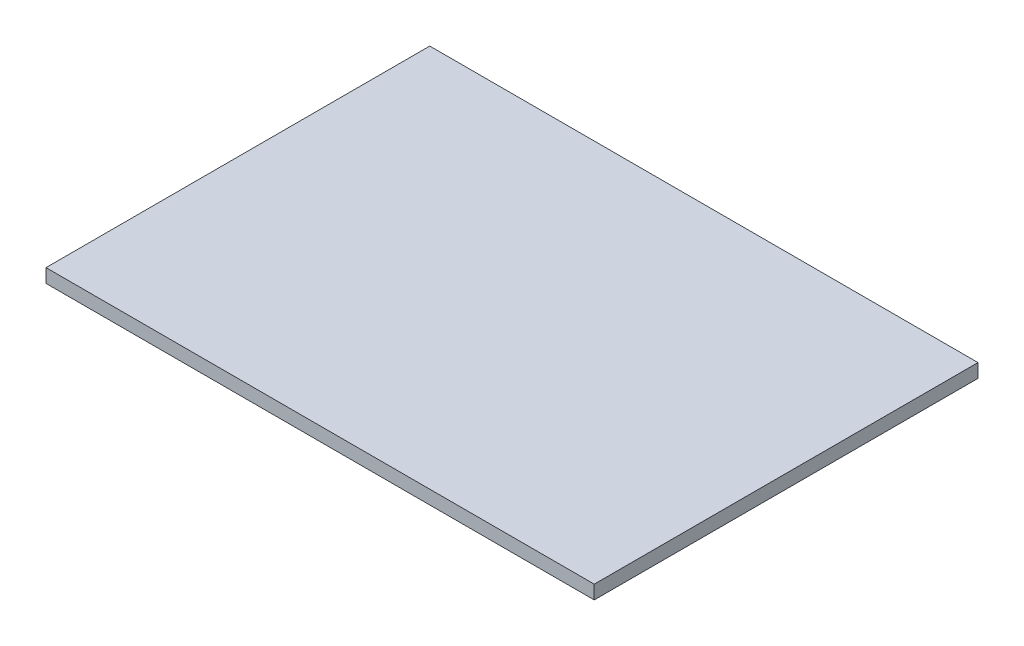
ISO-10303-21;
HEADER;
FILE_DESCRIPTION(('STEP AP214'),'2;1');
FILE_NAME('part.step','',(''),(''),'','','');
FILE_SCHEMA(('AUTOMOTIVE_DESIGN { 1 0 10303 214 1 1 1 1 }'));
ENDSEC;
DATA;
#1=APPLICATION_CONTEXT('core data for automotive mechanical design processes');
#2=APPLICATION_PROTOCOL_DEFINITION('international standard','automotive_design',2000,#1);
#3=PRODUCT_CONTEXT('',#1,'mechanical');
#4=PRODUCT('Part','Part','',(#3));
#5=PRODUCT_RELATED_PRODUCT_CATEGORY('part','',(#4));
#6=PRODUCT_DEFINITION_FORMATION('','',#4);
#7=PRODUCT_DEFINITION_CONTEXT('part definition',#1,'design');
#8=PRODUCT_DEFINITION('design','',#6,#7);
#9=PRODUCT_DEFINITION_SHAPE('','',#8);
#10=(LENGTH_UNIT() NAMED_UNIT(*) SI_UNIT(.MILLI.,.METRE.));
#11=(NAMED_UNIT(*) PLANE_ANGLE_UNIT() SI_UNIT($,.RADIAN.));
#12=(NAMED_UNIT(*) SI_UNIT($,.STERADIAN.) SOLID_ANGLE_UNIT());
#13=UNCERTAINTY_MEASURE_WITH_UNIT(LENGTH_MEASURE(1.E-05),#10,'distance_accuracy_value','');
#14=(GEOMETRIC_REPRESENTATION_CONTEXT(3) GLOBAL_UNCERTAINTY_ASSIGNED_CONTEXT((#13)) GLOBAL_UNIT_ASSIGNED_CONTEXT((#10,
#11,#12)) REPRESENTATION_CONTEXT('',''));
#15=CARTESIAN_POINT('',(0.,0.,0.));
#16=DIRECTION('',(0.,0.,1.));
#17=DIRECTION('',(1.,0.,0.));
#18=AXIS2_PLACEMENT_3D('',#15,#16,#17);
#19=CARTESIAN_POINT('',(0.,12.7,0.));
#20=DIRECTION('',(1.,0.,0.));
#21=DIRECTION('',(0.,0.,-1.));
#22=AXIS2_PLACEMENT_3D('',#19,#20,#21);
#23=PLANE('',#22);
#24=DIRECTION('',(0.,0.,1.));
#25=VECTOR('',#24,1.);
#26=CARTESIAN_POINT('',(0.,0.,0.));
#27=LINE('',#26,#25);
#28=CARTESIAN_POINT('',(0.,0.,-355.6));
#29=VERTEX_POINT('',#28);
#30=CARTESIAN_POINT('',(0.,0.,0.));
#31=VERTEX_POINT('',#30);
#32=EDGE_CURVE('E100',#29,#31,#27,.T.);
#33=ORIENTED_EDGE('',*,*,#32,.T.);
#34=DIRECTION('',(0.,-1.,0.));
#35=VECTOR('',#34,1.);
#36=CARTESIAN_POINT('',(0.,12.7,0.));
#37=LINE('',#36,#35);
#38=CARTESIAN_POINT('',(0.,12.7,0.));
#39=VERTEX_POINT('',#38);
#40=EDGE_CURVE('E11',#39,#31,#37,.T.);
#41=ORIENTED_EDGE('',*,*,#40,.F.);
#42=DIRECTION('',(0.,0.,1.));
#43=VECTOR('',#42,1.);
#44=CARTESIAN_POINT('',(0.,12.7,0.));
#45=LINE('',#44,#43);
#46=CARTESIAN_POINT('',(0.,12.7,-355.6));
#47=VERTEX_POINT('',#46);
#48=EDGE_CURVE('E88',#47,#39,#45,.T.);
#49=ORIENTED_EDGE('',*,*,#48,.F.);
#50=DIRECTION('',(0.,-1.,0.));
#51=VECTOR('',#50,1.);
#52=CARTESIAN_POINT('',(0.,12.7,-355.6));
#53=LINE('',#52,#51);
#54=EDGE_CURVE('E96',#47,#29,#53,.T.);
#55=ORIENTED_EDGE('',*,*,#54,.T.);
#56=EDGE_LOOP('',(#33,#41,#49,#55));
#57=FACE_BOUND('',#56,.T.);
#58=ADVANCED_FACE('F37',(#57),#23,.F.);
#59=CARTESIAN_POINT('',(0.,12.7,0.));
#60=DIRECTION('',(0.,0.,-1.));
#61=DIRECTION('',(-1.,0.,0.));
#62=AXIS2_PLACEMENT_3D('',#59,#60,#61);
#63=PLANE('',#62);
#64=DIRECTION('',(1.,0.,0.));
#65=VECTOR('',#64,1.);
#66=CARTESIAN_POINT('',(0.,0.,0.));
#67=LINE('',#66,#65);
#68=CARTESIAN_POINT('',(508.,0.,0.));
#69=VERTEX_POINT('',#68);
#70=EDGE_CURVE('E92',#31,#69,#67,.T.);
#71=ORIENTED_EDGE('',*,*,#70,.T.);
#72=DIRECTION('',(0.,-1.,0.));
#73=VECTOR('',#72,1.);
#74=CARTESIAN_POINT('',(508.,12.7,0.));
#75=LINE('',#74,#73);
#76=CARTESIAN_POINT('',(508.,12.7,0.));
#77=VERTEX_POINT('',#76);
#78=EDGE_CURVE('E45',#77,#69,#75,.T.);
#79=ORIENTED_EDGE('',*,*,#78,.F.);
#80=DIRECTION('',(1.,0.,0.));
#81=VECTOR('',#80,1.);
#82=CARTESIAN_POINT('',(0.,12.7,0.));
#83=LINE('',#82,#81);
#84=EDGE_CURVE('E83',#39,#77,#83,.T.);
#85=ORIENTED_EDGE('',*,*,#84,.F.);
#86=ORIENTED_EDGE('',*,*,#40,.T.);
#87=EDGE_LOOP('',(#71,#79,#85,#86));
#88=FACE_BOUND('',#87,.T.);
#89=ADVANCED_FACE('F91',(#88),#63,.F.);
#90=CARTESIAN_POINT('',(508.,12.7,0.));
#91=DIRECTION('',(-1.,0.,0.));
#92=DIRECTION('',(0.,0.,1.));
#93=AXIS2_PLACEMENT_3D('',#90,#91,#92);
#94=PLANE('',#93);
#95=DIRECTION('',(0.,0.,-1.));
#96=VECTOR('',#95,1.);
#97=CARTESIAN_POINT('',(508.,0.,0.));
#98=LINE('',#97,#96);
#99=CARTESIAN_POINT('',(508.,0.,-355.6));
#100=VERTEX_POINT('',#99);
#101=EDGE_CURVE('E70',#69,#100,#98,.T.);
#102=ORIENTED_EDGE('',*,*,#101,.T.);
#103=DIRECTION('',(0.,-1.,0.));
#104=VECTOR('',#103,1.);
#105=CARTESIAN_POINT('',(508.,12.7,-355.6));
#106=LINE('',#105,#104);
#107=CARTESIAN_POINT('',(508.,12.7,-355.6));
#108=VERTEX_POINT('',#107);
#109=EDGE_CURVE('E93',#108,#100,#106,.T.);
#110=ORIENTED_EDGE('',*,*,#109,.F.);
#111=DIRECTION('',(0.,0.,-1.));
#112=VECTOR('',#111,1.);
#113=CARTESIAN_POINT('',(508.,12.7,0.));
#114=LINE('',#113,#112);
#115=EDGE_CURVE('E86',#77,#108,#114,.T.);
#116=ORIENTED_EDGE('',*,*,#115,.F.);
#117=ORIENTED_EDGE('',*,*,#78,.T.);
#118=EDGE_LOOP('',(#102,#110,#116,#117));
#119=FACE_BOUND('',#118,.T.);
#120=ADVANCED_FACE('F94',(#119),#94,.F.);
#121=CARTESIAN_POINT('',(0.,12.7,-355.6));
#122=DIRECTION('',(0.,0.,1.));
#123=DIRECTION('',(1.,0.,0.));
#124=AXIS2_PLACEMENT_3D('',#121,#122,#123);
#125=PLANE('',#124);
#126=DIRECTION('',(-1.,0.,0.));
#127=VECTOR('',#126,1.);
#128=CARTESIAN_POINT('',(0.,0.,-355.6));
#129=LINE('',#128,#127);
#130=EDGE_CURVE('E76',#100,#29,#129,.T.);
#131=ORIENTED_EDGE('',*,*,#130,.T.);
#132=ORIENTED_EDGE('',*,*,#54,.F.);
#133=DIRECTION('',(-1.,0.,0.));
#134=VECTOR('',#133,1.);
#135=CARTESIAN_POINT('',(0.,12.7,-355.6));
#136=LINE('',#135,#134);
#137=EDGE_CURVE('E53',#108,#47,#136,.T.);
#138=ORIENTED_EDGE('',*,*,#137,.F.);
#139=ORIENTED_EDGE('',*,*,#109,.T.);
#140=EDGE_LOOP('',(#131,#132,#138,#139));
#141=FACE_BOUND('',#140,.T.);
#142=ADVANCED_FACE('F107',(#141),#125,.F.);
#143=CARTESIAN_POINT('',(0.,12.7,0.));
#144=DIRECTION('',(0.,-1.,0.));
#145=DIRECTION('',(0.,0.,-1.));
#146=AXIS2_PLACEMENT_3D('',#143,#144,#145);
#147=PLANE('',#146);
#148=ORIENTED_EDGE('',*,*,#48,.T.);
#149=ORIENTED_EDGE('',*,*,#84,.T.);
#150=ORIENTED_EDGE('',*,*,#115,.T.);
#151=ORIENTED_EDGE('',*,*,#137,.T.);
#152=EDGE_LOOP('',(#148,#149,#150,#151));
#153=FACE_BOUND('',#152,.T.);
#154=ADVANCED_FACE('F84',(#153),#147,.F.);
#155=CARTESIAN_POINT('',(0.,0.,0.));
#156=DIRECTION('',(0.,-1.,0.));
#157=DIRECTION('',(0.,0.,-1.));
#158=AXIS2_PLACEMENT_3D('',#155,#156,#157);
#159=PLANE('',#158);
#160=ORIENTED_EDGE('',*,*,#32,.F.);
#161=ORIENTED_EDGE('',*,*,#130,.F.);
#162=ORIENTED_EDGE('',*,*,#101,.F.);
#163=ORIENTED_EDGE('',*,*,#70,.F.);
#164=EDGE_LOOP('',(#160,#161,#162,#163));
#165=FACE_BOUND('',#164,.T.);
#166=ADVANCED_FACE('F110',(#165),#159,.T.);
#167=CLOSED_SHELL('',(#58,#89,#120,#142,#154,#166));
#168=MANIFOLD_SOLID_BREP('B2',#167);
#169=ADVANCED_BREP_SHAPE_REPRESENTATION('',(#18,#168),#14);
#170=SHAPE_DEFINITION_REPRESENTATION(#9,#169);
ENDSEC;
END-ISO-10303-21;
